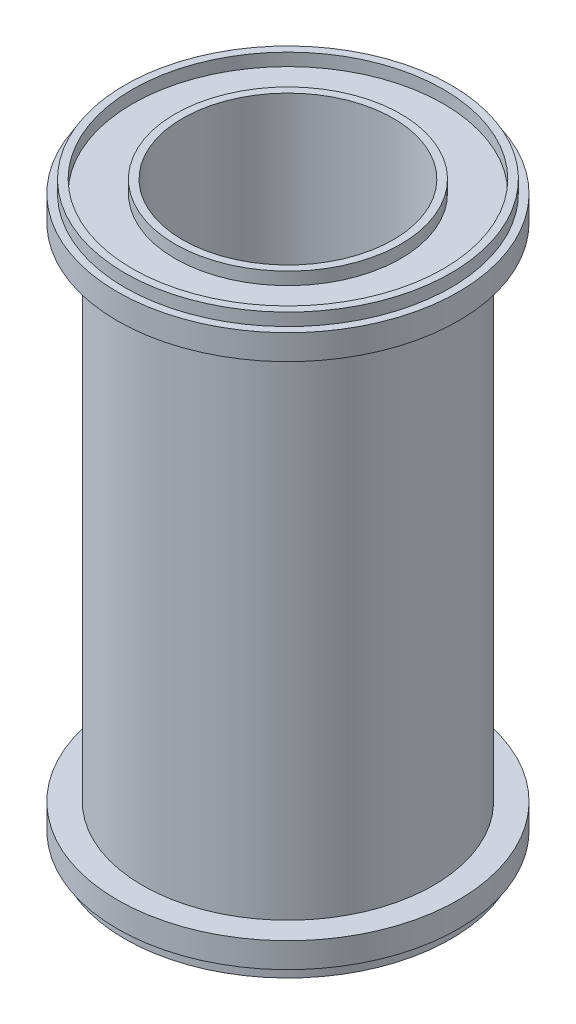
ISO-10303-21;
HEADER;
FILE_DESCRIPTION(('STEP AP214'),'2;1');
FILE_NAME('part.step','',(''),(''),'','','');
FILE_SCHEMA(('AUTOMOTIVE_DESIGN { 1 0 10303 214 1 1 1 1 }'));
ENDSEC;
DATA;
#1=APPLICATION_CONTEXT('core data for automotive mechanical design processes');
#2=APPLICATION_PROTOCOL_DEFINITION('international standard','automotive_design',2000,#1);
#3=PRODUCT_CONTEXT('',#1,'mechanical');
#4=PRODUCT('Part','Part','',(#3));
#5=PRODUCT_RELATED_PRODUCT_CATEGORY('part','',(#4));
#6=PRODUCT_DEFINITION_FORMATION('','',#4);
#7=PRODUCT_DEFINITION_CONTEXT('part definition',#1,'design');
#8=PRODUCT_DEFINITION('design','',#6,#7);
#9=PRODUCT_DEFINITION_SHAPE('','',#8);
#10=(LENGTH_UNIT() NAMED_UNIT(*) SI_UNIT(.MILLI.,.METRE.));
#11=(NAMED_UNIT(*) PLANE_ANGLE_UNIT() SI_UNIT($,.RADIAN.));
#12=(NAMED_UNIT(*) SI_UNIT($,.STERADIAN.) SOLID_ANGLE_UNIT());
#13=UNCERTAINTY_MEASURE_WITH_UNIT(LENGTH_MEASURE(1.E-05),#10,'distance_accuracy_value','');
#14=(GEOMETRIC_REPRESENTATION_CONTEXT(3) GLOBAL_UNCERTAINTY_ASSIGNED_CONTEXT((#13)) GLOBAL_UNIT_ASSIGNED_CONTEXT((#10,
#11,#12)) REPRESENTATION_CONTEXT('',''));
#15=CARTESIAN_POINT('',(0.,0.,0.));
#16=DIRECTION('',(0.,0.,1.));
#17=DIRECTION('',(1.,0.,0.));
#18=AXIS2_PLACEMENT_3D('',#15,#16,#17);
#19=CARTESIAN_POINT('',(0.,0.,0.));
#20=DIRECTION('',(0.,1.,0.));
#21=DIRECTION('',(0.,0.,1.));
#22=AXIS2_PLACEMENT_3D('',#19,#20,#21);
#23=CYLINDRICAL_SURFACE('',#22,4.2);
#24=CARTESIAN_POINT('',(0.,11.4999999999999,0.));
#25=DIRECTION('',(0.,1.,0.));
#26=DIRECTION('',(0.,0.,1.));
#27=AXIS2_PLACEMENT_3D('',#24,#25,#26);
#28=CIRCLE('',#27,4.2);
#29=CARTESIAN_POINT('',(0.,11.4999999999999,4.2));
#30=VERTEX_POINT('',#29);
#31=EDGE_CURVE('E119',#30,#30,#28,.T.);
#32=ORIENTED_EDGE('',*,*,#31,.T.);
#33=EDGE_LOOP('',(#32));
#34=FACE_BOUND('',#33,.T.);
#35=CARTESIAN_POINT('',(0.,-11.5000000000001,0.));
#36=DIRECTION('',(0.,1.,0.));
#37=DIRECTION('',(0.,0.,1.));
#38=AXIS2_PLACEMENT_3D('',#35,#36,#37);
#39=CIRCLE('',#38,4.2);
#40=CARTESIAN_POINT('',(0.,-11.5000000000001,4.2));
#41=VERTEX_POINT('',#40);
#42=EDGE_CURVE('E10',#41,#41,#39,.T.);
#43=ORIENTED_EDGE('',*,*,#42,.F.);
#44=EDGE_LOOP('',(#43));
#45=FACE_BOUND('',#44,.T.);
#46=ADVANCED_FACE('F36',(#34,#45),#23,.F.);
#47=CARTESIAN_POINT('',(0.,-11.5000000000001,4.5));
#48=DIRECTION('',(0.,-1.,0.));
#49=DIRECTION('',(0.,0.,-1.));
#50=AXIS2_PLACEMENT_3D('',#47,#48,#49);
#51=PLANE('',#50);
#52=ORIENTED_EDGE('',*,*,#42,.T.);
#53=EDGE_LOOP('',(#52));
#54=FACE_BOUND('',#53,.T.);
#55=CARTESIAN_POINT('',(0.,-11.5000000000001,0.));
#56=DIRECTION('',(0.,1.,0.));
#57=DIRECTION('',(0.,0.,1.));
#58=AXIS2_PLACEMENT_3D('',#55,#56,#57);
#59=CIRCLE('',#58,4.5);
#60=CARTESIAN_POINT('',(0.,-11.5000000000001,4.5));
#61=VERTEX_POINT('',#60);
#62=EDGE_CURVE('E43',#61,#61,#59,.T.);
#63=ORIENTED_EDGE('',*,*,#62,.F.);
#64=EDGE_LOOP('',(#63));
#65=FACE_BOUND('',#64,.T.);
#66=ADVANCED_FACE('F138',(#54,#65),#51,.T.);
#67=CARTESIAN_POINT('',(0.,0.,0.));
#68=DIRECTION('',(0.,1.,0.));
#69=DIRECTION('',(0.,0.,1.));
#70=AXIS2_PLACEMENT_3D('',#67,#68,#69);
#71=CYLINDRICAL_SURFACE('',#70,4.5);
#72=ORIENTED_EDGE('',*,*,#62,.T.);
#73=EDGE_LOOP('',(#72));
#74=FACE_BOUND('',#73,.T.);
#75=CARTESIAN_POINT('',(0.,-11.0000000000001,0.));
#76=DIRECTION('',(0.,1.,0.));
#77=DIRECTION('',(0.,0.,1.));
#78=AXIS2_PLACEMENT_3D('',#75,#76,#77);
#79=CIRCLE('',#78,4.5);
#80=CARTESIAN_POINT('',(0.,-11.0000000000001,4.5));
#81=VERTEX_POINT('',#80);
#82=EDGE_CURVE('E49',#81,#81,#79,.T.);
#83=ORIENTED_EDGE('',*,*,#82,.F.);
#84=EDGE_LOOP('',(#83));
#85=FACE_BOUND('',#84,.T.);
#86=ADVANCED_FACE('F142',(#74,#85),#71,.T.);
#87=CARTESIAN_POINT('',(0.,-11.0000000000001,6.20000000000001));
#88=DIRECTION('',(0.,-1.,0.));
#89=DIRECTION('',(0.,0.,-1.));
#90=AXIS2_PLACEMENT_3D('',#87,#88,#89);
#91=PLANE('',#90);
#92=ORIENTED_EDGE('',*,*,#82,.T.);
#93=EDGE_LOOP('',(#92));
#94=FACE_BOUND('',#93,.T.);
#95=CARTESIAN_POINT('',(0.,-11.0000000000001,0.));
#96=DIRECTION('',(0.,1.,0.));
#97=DIRECTION('',(0.,0.,1.));
#98=AXIS2_PLACEMENT_3D('',#95,#96,#97);
#99=CIRCLE('',#98,6.20000000000001);
#100=CARTESIAN_POINT('',(0.,-11.0000000000001,6.20000000000001));
#101=VERTEX_POINT('',#100);
#102=EDGE_CURVE('E54',#101,#101,#99,.T.);
#103=ORIENTED_EDGE('',*,*,#102,.F.);
#104=EDGE_LOOP('',(#103));
#105=FACE_BOUND('',#104,.T.);
#106=ADVANCED_FACE('F146',(#94,#105),#91,.T.);
#107=CARTESIAN_POINT('',(0.,0.,0.));
#108=DIRECTION('',(0.,1.,0.));
#109=DIRECTION('',(0.,0.,1.));
#110=AXIS2_PLACEMENT_3D('',#107,#108,#109);
#111=CYLINDRICAL_SURFACE('',#110,6.20000000000001);
#112=ORIENTED_EDGE('',*,*,#102,.T.);
#113=EDGE_LOOP('',(#112));
#114=FACE_BOUND('',#113,.T.);
#115=CARTESIAN_POINT('',(0.,-11.5000000000001,0.));
#116=DIRECTION('',(0.,1.,0.));
#117=DIRECTION('',(0.,0.,1.));
#118=AXIS2_PLACEMENT_3D('',#115,#116,#117);
#119=CIRCLE('',#118,6.20000000000001);
#120=CARTESIAN_POINT('',(0.,-11.5000000000001,6.20000000000001));
#121=VERTEX_POINT('',#120);
#122=EDGE_CURVE('E60',#121,#121,#119,.T.);
#123=ORIENTED_EDGE('',*,*,#122,.F.);
#124=EDGE_LOOP('',(#123));
#125=FACE_BOUND('',#124,.T.);
#126=ADVANCED_FACE('F152',(#114,#125),#111,.F.);
#127=CARTESIAN_POINT('',(0.,-11.5000000000001,6.5));
#128=DIRECTION('',(0.,-1.,0.));
#129=DIRECTION('',(0.,0.,-1.));
#130=AXIS2_PLACEMENT_3D('',#127,#128,#129);
#131=PLANE('',#130);
#132=ORIENTED_EDGE('',*,*,#122,.T.);
#133=EDGE_LOOP('',(#132));
#134=FACE_BOUND('',#133,.T.);
#135=CARTESIAN_POINT('',(0.,-11.5000000000001,0.));
#136=DIRECTION('',(0.,1.,0.));
#137=DIRECTION('',(0.,0.,1.));
#138=AXIS2_PLACEMENT_3D('',#135,#136,#137);
#139=CIRCLE('',#138,6.5);
#140=CARTESIAN_POINT('',(0.,-11.5000000000001,6.5));
#141=VERTEX_POINT('',#140);
#142=EDGE_CURVE('E64',#141,#141,#139,.T.);
#143=ORIENTED_EDGE('',*,*,#142,.F.);
#144=EDGE_LOOP('',(#143));
#145=FACE_BOUND('',#144,.T.);
#146=ADVANCED_FACE('F156',(#134,#145),#131,.T.);
#147=CARTESIAN_POINT('',(0.,0.,0.));
#148=DIRECTION('',(0.,1.,0.));
#149=DIRECTION('',(0.,0.,1.));
#150=AXIS2_PLACEMENT_3D('',#147,#148,#149);
#151=CYLINDRICAL_SURFACE('',#150,6.5);
#152=ORIENTED_EDGE('',*,*,#142,.T.);
#153=EDGE_LOOP('',(#152));
#154=FACE_BOUND('',#153,.T.);
#155=CARTESIAN_POINT('',(0.,-11.0000000000001,0.));
#156=DIRECTION('',(0.,1.,0.));
#157=DIRECTION('',(0.,0.,1.));
#158=AXIS2_PLACEMENT_3D('',#155,#156,#157);
#159=CIRCLE('',#158,6.5);
#160=CARTESIAN_POINT('',(0.,-11.0000000000001,6.5));
#161=VERTEX_POINT('',#160);
#162=EDGE_CURVE('E68',#161,#161,#159,.T.);
#163=ORIENTED_EDGE('',*,*,#162,.F.);
#164=EDGE_LOOP('',(#163));
#165=FACE_BOUND('',#164,.T.);
#166=ADVANCED_FACE('F160',(#154,#165),#151,.T.);
#167=CARTESIAN_POINT('',(0.,-11.0000000000001,6.8000000000001));
#168=DIRECTION('',(0.,-1.,0.));
#169=DIRECTION('',(0.,0.,-1.));
#170=AXIS2_PLACEMENT_3D('',#167,#168,#169);
#171=PLANE('',#170);
#172=ORIENTED_EDGE('',*,*,#162,.T.);
#173=EDGE_LOOP('',(#172));
#174=FACE_BOUND('',#173,.T.);
#175=CARTESIAN_POINT('',(0.,-11.0000000000001,0.));
#176=DIRECTION('',(0.,1.,0.));
#177=DIRECTION('',(0.,0.,1.));
#178=AXIS2_PLACEMENT_3D('',#175,#176,#177);
#179=CIRCLE('',#178,6.8000000000001);
#180=CARTESIAN_POINT('',(0.,-11.0000000000001,6.8000000000001));
#181=VERTEX_POINT('',#180);
#182=EDGE_CURVE('E72',#181,#181,#179,.T.);
#183=ORIENTED_EDGE('',*,*,#182,.F.);
#184=EDGE_LOOP('',(#183));
#185=FACE_BOUND('',#184,.T.);
#186=ADVANCED_FACE('F164',(#174,#185),#171,.T.);
#187=CARTESIAN_POINT('',(0.,0.,0.));
#188=DIRECTION('',(0.,1.,0.));
#189=DIRECTION('',(0.,0.,1.));
#190=AXIS2_PLACEMENT_3D('',#187,#188,#189);
#191=CYLINDRICAL_SURFACE('',#190,6.8000000000001);
#192=ORIENTED_EDGE('',*,*,#182,.T.);
#193=EDGE_LOOP('',(#192));
#194=FACE_BOUND('',#193,.T.);
#195=CARTESIAN_POINT('',(0.,-10.0000000000001,0.));
#196=DIRECTION('',(0.,1.,0.));
#197=DIRECTION('',(0.,0.,1.));
#198=AXIS2_PLACEMENT_3D('',#195,#196,#197);
#199=CIRCLE('',#198,6.8000000000001);
#200=CARTESIAN_POINT('',(0.,-10.0000000000001,6.8000000000001));
#201=VERTEX_POINT('',#200);
#202=EDGE_CURVE('E76',#201,#201,#199,.T.);
#203=ORIENTED_EDGE('',*,*,#202,.F.);
#204=EDGE_LOOP('',(#203));
#205=FACE_BOUND('',#204,.T.);
#206=ADVANCED_FACE('F168',(#194,#205),#191,.T.);
#207=CARTESIAN_POINT('',(0.,-10.0000000000001,5.79999999999991));
#208=DIRECTION('',(0.,1.,0.));
#209=DIRECTION('',(0.,0.,1.));
#210=AXIS2_PLACEMENT_3D('',#207,#208,#209);
#211=PLANE('',#210);
#212=ORIENTED_EDGE('',*,*,#202,.T.);
#213=EDGE_LOOP('',(#212));
#214=FACE_BOUND('',#213,.T.);
#215=CARTESIAN_POINT('',(0.,-10.0000000000001,0.));
#216=DIRECTION('',(0.,1.,0.));
#217=DIRECTION('',(0.,0.,1.));
#218=AXIS2_PLACEMENT_3D('',#215,#216,#217);
#219=CIRCLE('',#218,5.79999999999991);
#220=CARTESIAN_POINT('',(0.,-10.0000000000001,5.79999999999991));
#221=VERTEX_POINT('',#220);
#222=EDGE_CURVE('E80',#221,#221,#219,.T.);
#223=ORIENTED_EDGE('',*,*,#222,.F.);
#224=EDGE_LOOP('',(#223));
#225=FACE_BOUND('',#224,.T.);
#226=ADVANCED_FACE('F172',(#214,#225),#211,.T.);
#227=CARTESIAN_POINT('',(0.,0.,0.));
#228=DIRECTION('',(0.,1.,0.));
#229=DIRECTION('',(0.,0.,1.));
#230=AXIS2_PLACEMENT_3D('',#227,#228,#229);
#231=CYLINDRICAL_SURFACE('',#230,5.79999999999991);
#232=ORIENTED_EDGE('',*,*,#222,.T.);
#233=EDGE_LOOP('',(#232));
#234=FACE_BOUND('',#233,.T.);
#235=CARTESIAN_POINT('',(0.,9.99999999999993,0.));
#236=DIRECTION('',(0.,1.,0.));
#237=DIRECTION('',(0.,0.,1.));
#238=AXIS2_PLACEMENT_3D('',#235,#236,#237);
#239=CIRCLE('',#238,5.79999999999991);
#240=CARTESIAN_POINT('',(0.,9.99999999999993,5.79999999999991));
#241=VERTEX_POINT('',#240);
#242=EDGE_CURVE('E83',#241,#241,#239,.T.);
#243=ORIENTED_EDGE('',*,*,#242,.F.);
#244=EDGE_LOOP('',(#243));
#245=FACE_BOUND('',#244,.T.);
#246=ADVANCED_FACE('F176',(#234,#245),#231,.T.);
#247=CARTESIAN_POINT('',(0.,10.,5.79999999999991));
#248=DIRECTION('',(0.,-1.,0.));
#249=DIRECTION('',(0.,0.,-1.));
#250=AXIS2_PLACEMENT_3D('',#247,#248,#249);
#251=PLANE('',#250);
#252=ORIENTED_EDGE('',*,*,#242,.T.);
#253=EDGE_LOOP('',(#252));
#254=FACE_BOUND('',#253,.T.);
#255=CARTESIAN_POINT('',(0.,10.0000000000001,0.));
#256=DIRECTION('',(0.,1.,0.));
#257=DIRECTION('',(0.,0.,1.));
#258=AXIS2_PLACEMENT_3D('',#255,#256,#257);
#259=CIRCLE('',#258,6.8000000000001);
#260=CARTESIAN_POINT('',(0.,10.0000000000001,6.8000000000001));
#261=VERTEX_POINT('',#260);
#262=EDGE_CURVE('E87',#261,#261,#259,.T.);
#263=ORIENTED_EDGE('',*,*,#262,.F.);
#264=EDGE_LOOP('',(#263));
#265=FACE_BOUND('',#264,.T.);
#266=ADVANCED_FACE('F180',(#254,#265),#251,.T.);
#267=CARTESIAN_POINT('',(0.,0.,0.));
#268=DIRECTION('',(0.,1.,0.));
#269=DIRECTION('',(0.,0.,1.));
#270=AXIS2_PLACEMENT_3D('',#267,#268,#269);
#271=CYLINDRICAL_SURFACE('',#270,6.8000000000001);
#272=ORIENTED_EDGE('',*,*,#262,.T.);
#273=EDGE_LOOP('',(#272));
#274=FACE_BOUND('',#273,.T.);
#275=CARTESIAN_POINT('',(0.,11.0000000000001,0.));
#276=DIRECTION('',(0.,1.,0.));
#277=DIRECTION('',(0.,0.,1.));
#278=AXIS2_PLACEMENT_3D('',#275,#276,#277);
#279=CIRCLE('',#278,6.8000000000001);
#280=CARTESIAN_POINT('',(0.,11.0000000000001,6.8000000000001));
#281=VERTEX_POINT('',#280);
#282=EDGE_CURVE('E91',#281,#281,#279,.T.);
#283=ORIENTED_EDGE('',*,*,#282,.F.);
#284=EDGE_LOOP('',(#283));
#285=FACE_BOUND('',#284,.T.);
#286=ADVANCED_FACE('F184',(#274,#285),#271,.T.);
#287=CARTESIAN_POINT('',(0.,11.0000000000001,6.8000000000001));
#288=DIRECTION('',(0.,1.,0.));
#289=DIRECTION('',(0.,0.,1.));
#290=AXIS2_PLACEMENT_3D('',#287,#288,#289);
#291=PLANE('',#290);
#292=ORIENTED_EDGE('',*,*,#282,.T.);
#293=EDGE_LOOP('',(#292));
#294=FACE_BOUND('',#293,.T.);
#295=CARTESIAN_POINT('',(0.,11.0000000000001,0.));
#296=DIRECTION('',(0.,1.,0.));
#297=DIRECTION('',(0.,0.,1.));
#298=AXIS2_PLACEMENT_3D('',#295,#296,#297);
#299=CIRCLE('',#298,6.5);
#300=CARTESIAN_POINT('',(0.,11.0000000000001,6.5));
#301=VERTEX_POINT('',#300);
#302=EDGE_CURVE('E95',#301,#301,#299,.T.);
#303=ORIENTED_EDGE('',*,*,#302,.F.);
#304=EDGE_LOOP('',(#303));
#305=FACE_BOUND('',#304,.T.);
#306=ADVANCED_FACE('F188',(#294,#305),#291,.T.);
#307=CARTESIAN_POINT('',(0.,0.,0.));
#308=DIRECTION('',(0.,1.,0.));
#309=DIRECTION('',(0.,0.,1.));
#310=AXIS2_PLACEMENT_3D('',#307,#308,#309);
#311=CYLINDRICAL_SURFACE('',#310,6.5);
#312=ORIENTED_EDGE('',*,*,#302,.T.);
#313=EDGE_LOOP('',(#312));
#314=FACE_BOUND('',#313,.T.);
#315=CARTESIAN_POINT('',(0.,11.5000000000001,0.));
#316=DIRECTION('',(0.,1.,0.));
#317=DIRECTION('',(0.,0.,1.));
#318=AXIS2_PLACEMENT_3D('',#315,#316,#317);
#319=CIRCLE('',#318,6.5);
#320=CARTESIAN_POINT('',(0.,11.5000000000001,6.5));
#321=VERTEX_POINT('',#320);
#322=EDGE_CURVE('E99',#321,#321,#319,.T.);
#323=ORIENTED_EDGE('',*,*,#322,.F.);
#324=EDGE_LOOP('',(#323));
#325=FACE_BOUND('',#324,.T.);
#326=ADVANCED_FACE('F192',(#314,#325),#311,.T.);
#327=CARTESIAN_POINT('',(0.,11.5000000000001,6.5));
#328=DIRECTION('',(0.,1.,0.));
#329=DIRECTION('',(0.,0.,1.));
#330=AXIS2_PLACEMENT_3D('',#327,#328,#329);
#331=PLANE('',#330);
#332=ORIENTED_EDGE('',*,*,#322,.T.);
#333=EDGE_LOOP('',(#332));
#334=FACE_BOUND('',#333,.T.);
#335=CARTESIAN_POINT('',(0.,11.5000000000001,0.));
#336=DIRECTION('',(0.,1.,0.));
#337=DIRECTION('',(0.,0.,1.));
#338=AXIS2_PLACEMENT_3D('',#335,#336,#337);
#339=CIRCLE('',#338,6.2);
#340=CARTESIAN_POINT('',(0.,11.5000000000001,6.2));
#341=VERTEX_POINT('',#340);
#342=EDGE_CURVE('E103',#341,#341,#339,.T.);
#343=ORIENTED_EDGE('',*,*,#342,.F.);
#344=EDGE_LOOP('',(#343));
#345=FACE_BOUND('',#344,.T.);
#346=ADVANCED_FACE('F196',(#334,#345),#331,.T.);
#347=CARTESIAN_POINT('',(0.,0.,0.));
#348=DIRECTION('',(0.,1.,0.));
#349=DIRECTION('',(0.,0.,1.));
#350=AXIS2_PLACEMENT_3D('',#347,#348,#349);
#351=CYLINDRICAL_SURFACE('',#350,6.2);
#352=ORIENTED_EDGE('',*,*,#342,.T.);
#353=EDGE_LOOP('',(#352));
#354=FACE_BOUND('',#353,.T.);
#355=CARTESIAN_POINT('',(0.,11.0000000000001,0.));
#356=DIRECTION('',(0.,1.,0.));
#357=DIRECTION('',(0.,0.,1.));
#358=AXIS2_PLACEMENT_3D('',#355,#356,#357);
#359=CIRCLE('',#358,6.2);
#360=CARTESIAN_POINT('',(0.,11.0000000000001,6.2));
#361=VERTEX_POINT('',#360);
#362=EDGE_CURVE('E107',#361,#361,#359,.T.);
#363=ORIENTED_EDGE('',*,*,#362,.F.);
#364=EDGE_LOOP('',(#363));
#365=FACE_BOUND('',#364,.T.);
#366=ADVANCED_FACE('F200',(#354,#365),#351,.F.);
#367=CARTESIAN_POINT('',(0.,11.0000000000001,6.2));
#368=DIRECTION('',(0.,1.,0.));
#369=DIRECTION('',(0.,0.,1.));
#370=AXIS2_PLACEMENT_3D('',#367,#368,#369);
#371=PLANE('',#370);
#372=ORIENTED_EDGE('',*,*,#362,.T.);
#373=EDGE_LOOP('',(#372));
#374=FACE_BOUND('',#373,.T.);
#375=CARTESIAN_POINT('',(0.,11.0000000000001,0.));
#376=DIRECTION('',(0.,1.,0.));
#377=DIRECTION('',(0.,0.,1.));
#378=AXIS2_PLACEMENT_3D('',#375,#376,#377);
#379=CIRCLE('',#378,4.5);
#380=CARTESIAN_POINT('',(0.,11.0000000000001,4.5));
#381=VERTEX_POINT('',#380);
#382=EDGE_CURVE('E111',#381,#381,#379,.T.);
#383=ORIENTED_EDGE('',*,*,#382,.F.);
#384=EDGE_LOOP('',(#383));
#385=FACE_BOUND('',#384,.T.);
#386=ADVANCED_FACE('F134',(#374,#385),#371,.T.);
#387=CARTESIAN_POINT('',(0.,0.,0.));
#388=DIRECTION('',(0.,1.,0.));
#389=DIRECTION('',(0.,0.,1.));
#390=AXIS2_PLACEMENT_3D('',#387,#388,#389);
#391=CYLINDRICAL_SURFACE('',#390,4.5);
#392=ORIENTED_EDGE('',*,*,#382,.T.);
#393=EDGE_LOOP('',(#392));
#394=FACE_BOUND('',#393,.T.);
#395=CARTESIAN_POINT('',(0.,11.5000000000001,0.));
#396=DIRECTION('',(0.,1.,0.));
#397=DIRECTION('',(0.,0.,1.));
#398=AXIS2_PLACEMENT_3D('',#395,#396,#397);
#399=CIRCLE('',#398,4.5);
#400=CARTESIAN_POINT('',(0.,11.5000000000001,4.5));
#401=VERTEX_POINT('',#400);
#402=EDGE_CURVE('E115',#401,#401,#399,.T.);
#403=ORIENTED_EDGE('',*,*,#402,.F.);
#404=EDGE_LOOP('',(#403));
#405=FACE_BOUND('',#404,.T.);
#406=ADVANCED_FACE('F128',(#394,#405),#391,.T.);
#407=CARTESIAN_POINT('',(0.,11.5,4.5));
#408=DIRECTION('',(0.,1.,0.));
#409=DIRECTION('',(0.,0.,1.));
#410=AXIS2_PLACEMENT_3D('',#407,#408,#409);
#411=PLANE('',#410);
#412=ORIENTED_EDGE('',*,*,#402,.T.);
#413=EDGE_LOOP('',(#412));
#414=FACE_BOUND('',#413,.T.);
#415=ORIENTED_EDGE('',*,*,#31,.F.);
#416=EDGE_LOOP('',(#415));
#417=FACE_BOUND('',#416,.T.);
#418=ADVANCED_FACE('F126',(#414,#417),#411,.T.);
#419=CLOSED_SHELL('',(#46,#66,#86,#106,#126,#146,#166,#186,#206,#226,#246,#266,#286,#306,#326,
#346,#366,#386,#406,#418));
#420=MANIFOLD_SOLID_BREP('B2',#419);
#421=ADVANCED_BREP_SHAPE_REPRESENTATION('',(#18,#420),#14);
#422=SHAPE_DEFINITION_REPRESENTATION(#9,#421);
ENDSEC;
END-ISO-10303-21;
